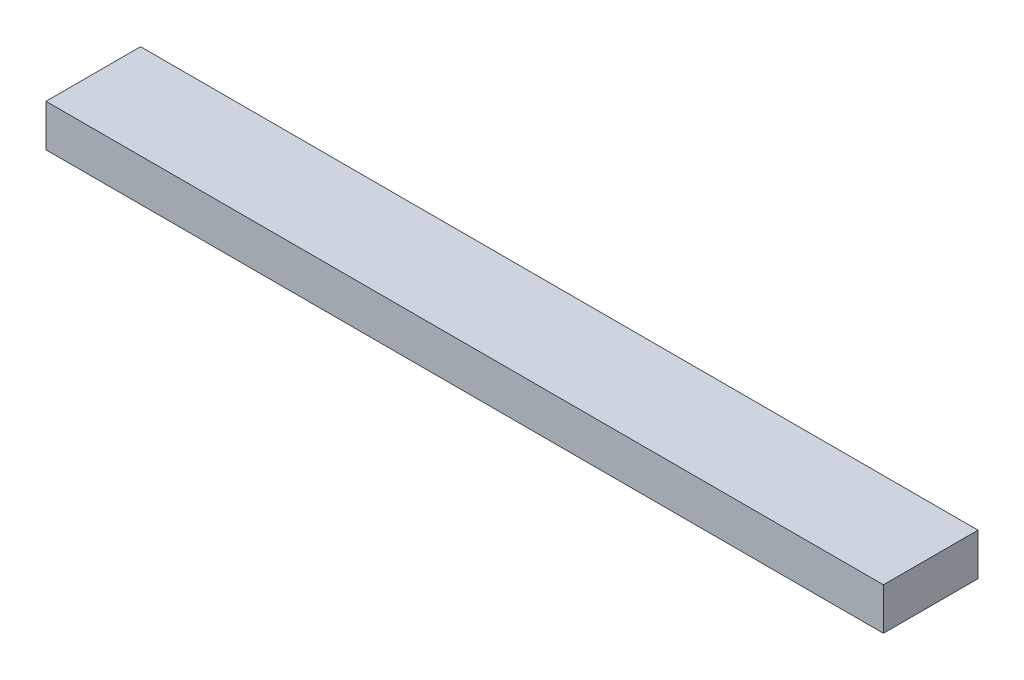
ISO-10303-21;
HEADER;
FILE_DESCRIPTION(('STEP AP214'),'2;1');
FILE_NAME('part.step','',(''),(''),'','','');
FILE_SCHEMA(('AUTOMOTIVE_DESIGN { 1 0 10303 214 1 1 1 1 }'));
ENDSEC;
DATA;
#1=APPLICATION_CONTEXT('core data for automotive mechanical design processes');
#2=APPLICATION_PROTOCOL_DEFINITION('international standard','automotive_design',2000,#1);
#3=PRODUCT_CONTEXT('',#1,'mechanical');
#4=PRODUCT('Part','Part','',(#3));
#5=PRODUCT_RELATED_PRODUCT_CATEGORY('part','',(#4));
#6=PRODUCT_DEFINITION_FORMATION('','',#4);
#7=PRODUCT_DEFINITION_CONTEXT('part definition',#1,'design');
#8=PRODUCT_DEFINITION('design','',#6,#7);
#9=PRODUCT_DEFINITION_SHAPE('','',#8);
#10=(LENGTH_UNIT() NAMED_UNIT(*) SI_UNIT(.MILLI.,.METRE.));
#11=(NAMED_UNIT(*) PLANE_ANGLE_UNIT() SI_UNIT($,.RADIAN.));
#12=(NAMED_UNIT(*) SI_UNIT($,.STERADIAN.) SOLID_ANGLE_UNIT());
#13=UNCERTAINTY_MEASURE_WITH_UNIT(LENGTH_MEASURE(1.E-05),#10,'distance_accuracy_value','');
#14=(GEOMETRIC_REPRESENTATION_CONTEXT(3) GLOBAL_UNCERTAINTY_ASSIGNED_CONTEXT((#13)) GLOBAL_UNIT_ASSIGNED_CONTEXT((#10,
#11,#12)) REPRESENTATION_CONTEXT('',''));
#15=CARTESIAN_POINT('',(0.,0.,0.));
#16=DIRECTION('',(0.,0.,1.));
#17=DIRECTION('',(1.,0.,0.));
#18=AXIS2_PLACEMENT_3D('',#15,#16,#17);
#19=CARTESIAN_POINT('',(0.,0.,0.));
#20=DIRECTION('',(0.,0.,-1.));
#21=DIRECTION('',(-1.,0.,0.));
#22=AXIS2_PLACEMENT_3D('',#19,#20,#21);
#23=PLANE('',#22);
#24=CARTESIAN_POINT('',(0.,-304.8,0.));
#25=DIRECTION('',(0.,0.,-1.));
#26=DIRECTION('',(-1.,0.,0.));
#27=AXIS2_PLACEMENT_3D('',#24,#25,#26);
#28=CIRCLE('',#27,1.5875);
#29=CARTESIAN_POINT('',(-1.5875,-304.8,0.));
#30=VERTEX_POINT('',#29);
#31=EDGE_CURVE('E39',#30,#30,#28,.T.);
#32=ORIENTED_EDGE('',*,*,#31,.F.);
#33=EDGE_LOOP('',(#32));
#34=FACE_BOUND('',#33,.T.);
#35=CARTESIAN_POINT('',(-107.438766336441,-304.8,0.));
#36=DIRECTION('',(0.,0.,-1.));
#37=DIRECTION('',(-1.,0.,0.));
#38=AXIS2_PLACEMENT_3D('',#35,#36,#37);
#39=CIRCLE('',#38,1.58750000000001);
#40=CARTESIAN_POINT('',(-109.026266336441,-304.8,0.));
#41=VERTEX_POINT('',#40);
#42=EDGE_CURVE('E98',#41,#41,#39,.T.);
#43=ORIENTED_EDGE('',*,*,#42,.F.);
#44=EDGE_LOOP('',(#43));
#45=FACE_BOUND('',#44,.T.);
#46=CARTESIAN_POINT('',(107.438766336441,-304.8,0.));
#47=DIRECTION('',(0.,0.,-1.));
#48=DIRECTION('',(-1.,0.,0.));
#49=AXIS2_PLACEMENT_3D('',#46,#47,#48);
#50=CIRCLE('',#49,1.58750000000001);
#51=CARTESIAN_POINT('',(105.851266336441,-304.8,0.));
#52=VERTEX_POINT('',#51);
#53=EDGE_CURVE('E102',#52,#52,#50,.T.);
#54=ORIENTED_EDGE('',*,*,#53,.F.);
#55=EDGE_LOOP('',(#54));
#56=FACE_BOUND('',#55,.T.);
#57=DIRECTION('',(0.,-1.,0.));
#58=VECTOR('',#57,1.);
#59=CARTESIAN_POINT('',(-126.488766336441,-311.15,0.));
#60=LINE('',#59,#58);
#61=CARTESIAN_POINT('',(-126.488766336441,-298.45,0.));
#62=VERTEX_POINT('',#61);
#63=CARTESIAN_POINT('',(-126.488766336441,-311.15,0.));
#64=VERTEX_POINT('',#63);
#65=EDGE_CURVE('E107',#62,#64,#60,.T.);
#66=ORIENTED_EDGE('',*,*,#65,.F.);
#67=DIRECTION('',(-1.,0.,0.));
#68=VECTOR('',#67,1.);
#69=CARTESIAN_POINT('',(-126.488766336441,-298.45,0.));
#70=LINE('',#69,#68);
#71=CARTESIAN_POINT('',(126.488766336441,-298.45,0.));
#72=VERTEX_POINT('',#71);
#73=EDGE_CURVE('E116',#72,#62,#70,.T.);
#74=ORIENTED_EDGE('',*,*,#73,.F.);
#75=DIRECTION('',(0.,1.,0.));
#76=VECTOR('',#75,1.);
#77=CARTESIAN_POINT('',(126.488766336441,-311.15,0.));
#78=LINE('',#77,#76);
#79=CARTESIAN_POINT('',(126.488766336441,-311.15,0.));
#80=VERTEX_POINT('',#79);
#81=EDGE_CURVE('E113',#80,#72,#78,.T.);
#82=ORIENTED_EDGE('',*,*,#81,.F.);
#83=DIRECTION('',(1.,0.,0.));
#84=VECTOR('',#83,1.);
#85=CARTESIAN_POINT('',(-126.488766336441,-311.15,0.));
#86=LINE('',#85,#84);
#87=EDGE_CURVE('E110',#64,#80,#86,.T.);
#88=ORIENTED_EDGE('',*,*,#87,.F.);
#89=EDGE_LOOP('',(#66,#74,#82,#88));
#90=FACE_BOUND('',#89,.T.);
#91=ADVANCED_FACE('F35',(#34,#45,#56,#90),#23,.T.);
#92=CARTESIAN_POINT('',(-126.488766336441,-298.45,281.871115322085));
#93=DIRECTION('',(0.,-1.,0.));
#94=DIRECTION('',(0.,0.,-1.));
#95=AXIS2_PLACEMENT_3D('',#92,#93,#94);
#96=PLANE('',#95);
#97=DIRECTION('',(0.,0.,-1.));
#98=VECTOR('',#97,1.);
#99=CARTESIAN_POINT('',(-126.488766336441,-298.45,281.871115322085));
#100=LINE('',#99,#98);
#101=CARTESIAN_POINT('',(-126.488766336441,-298.45,28.575));
#102=VERTEX_POINT('',#101);
#103=EDGE_CURVE('E119',#102,#62,#100,.T.);
#104=ORIENTED_EDGE('',*,*,#103,.F.);
#105=DIRECTION('',(1.,0.,0.));
#106=VECTOR('',#105,1.);
#107=CARTESIAN_POINT('',(-126.488766336441,-298.45,28.575));
#108=LINE('',#107,#106);
#109=CARTESIAN_POINT('',(126.488766336441,-298.45,28.575));
#110=VERTEX_POINT('',#109);
#111=EDGE_CURVE('E56',#102,#110,#108,.T.);
#112=ORIENTED_EDGE('',*,*,#111,.T.);
#113=DIRECTION('',(0.,0.,-1.));
#114=VECTOR('',#113,1.);
#115=CARTESIAN_POINT('',(126.488766336441,-298.45,281.871115322085));
#116=LINE('',#115,#114);
#117=EDGE_CURVE('E121',#110,#72,#116,.T.);
#118=ORIENTED_EDGE('',*,*,#117,.T.);
#119=ORIENTED_EDGE('',*,*,#73,.T.);
#120=EDGE_LOOP('',(#104,#112,#118,#119));
#121=FACE_BOUND('',#120,.T.);
#122=ADVANCED_FACE('F136',(#121),#96,.F.);
#123=CARTESIAN_POINT('',(126.488766336441,-311.15,281.871115322085));
#124=DIRECTION('',(-1.,0.,0.));
#125=DIRECTION('',(0.,0.,1.));
#126=AXIS2_PLACEMENT_3D('',#123,#124,#125);
#127=PLANE('',#126);
#128=ORIENTED_EDGE('',*,*,#117,.F.);
#129=DIRECTION('',(0.,-1.,0.));
#130=VECTOR('',#129,1.);
#131=CARTESIAN_POINT('',(126.488766336441,-311.15,28.575));
#132=LINE('',#131,#130);
#133=CARTESIAN_POINT('',(126.488766336441,-311.15,28.575));
#134=VERTEX_POINT('',#133);
#135=EDGE_CURVE('E103',#110,#134,#132,.T.);
#136=ORIENTED_EDGE('',*,*,#135,.T.);
#137=DIRECTION('',(0.,0.,-1.));
#138=VECTOR('',#137,1.);
#139=CARTESIAN_POINT('',(126.488766336441,-311.15,281.871115322085));
#140=LINE('',#139,#138);
#141=EDGE_CURVE('E123',#134,#80,#140,.T.);
#142=ORIENTED_EDGE('',*,*,#141,.T.);
#143=ORIENTED_EDGE('',*,*,#81,.T.);
#144=EDGE_LOOP('',(#128,#136,#142,#143));
#145=FACE_BOUND('',#144,.T.);
#146=ADVANCED_FACE('F151',(#145),#127,.F.);
#147=CARTESIAN_POINT('',(-126.488766336441,-311.15,281.871115322085));
#148=DIRECTION('',(0.,1.,0.));
#149=DIRECTION('',(0.,0.,1.));
#150=AXIS2_PLACEMENT_3D('',#147,#148,#149);
#151=PLANE('',#150);
#152=ORIENTED_EDGE('',*,*,#141,.F.);
#153=DIRECTION('',(-1.,0.,0.));
#154=VECTOR('',#153,1.);
#155=CARTESIAN_POINT('',(-126.488766336441,-311.15,28.575));
#156=LINE('',#155,#154);
#157=CARTESIAN_POINT('',(-126.488766336441,-311.15,28.575));
#158=VERTEX_POINT('',#157);
#159=EDGE_CURVE('E44',#134,#158,#156,.T.);
#160=ORIENTED_EDGE('',*,*,#159,.T.);
#161=DIRECTION('',(0.,0.,-1.));
#162=VECTOR('',#161,1.);
#163=CARTESIAN_POINT('',(-126.488766336441,-311.15,281.871115322085));
#164=LINE('',#163,#162);
#165=EDGE_CURVE('E125',#158,#64,#164,.T.);
#166=ORIENTED_EDGE('',*,*,#165,.T.);
#167=ORIENTED_EDGE('',*,*,#87,.T.);
#168=EDGE_LOOP('',(#152,#160,#166,#167));
#169=FACE_BOUND('',#168,.T.);
#170=ADVANCED_FACE('F153',(#169),#151,.F.);
#171=CARTESIAN_POINT('',(-126.488766336441,-311.15,281.871115322085));
#172=DIRECTION('',(1.,0.,0.));
#173=DIRECTION('',(0.,0.,-1.));
#174=AXIS2_PLACEMENT_3D('',#171,#172,#173);
#175=PLANE('',#174);
#176=ORIENTED_EDGE('',*,*,#165,.F.);
#177=DIRECTION('',(0.,1.,0.));
#178=VECTOR('',#177,1.);
#179=CARTESIAN_POINT('',(-126.488766336441,-311.15,28.575));
#180=LINE('',#179,#178);
#181=EDGE_CURVE('E11',#158,#102,#180,.T.);
#182=ORIENTED_EDGE('',*,*,#181,.T.);
#183=ORIENTED_EDGE('',*,*,#103,.T.);
#184=ORIENTED_EDGE('',*,*,#65,.T.);
#185=EDGE_LOOP('',(#176,#182,#183,#184));
#186=FACE_BOUND('',#185,.T.);
#187=ADVANCED_FACE('F37',(#186),#175,.F.);
#188=CARTESIAN_POINT('',(0.,0.,28.575));
#189=DIRECTION('',(0.,0.,-1.));
#190=DIRECTION('',(-1.,0.,0.));
#191=AXIS2_PLACEMENT_3D('',#188,#189,#190);
#192=PLANE('',#191);
#193=ORIENTED_EDGE('',*,*,#159,.F.);
#194=ORIENTED_EDGE('',*,*,#135,.F.);
#195=ORIENTED_EDGE('',*,*,#111,.F.);
#196=ORIENTED_EDGE('',*,*,#181,.F.);
#197=EDGE_LOOP('',(#193,#194,#195,#196));
#198=FACE_BOUND('',#197,.T.);
#199=ADVANCED_FACE('F159',(#198),#192,.F.);
#200=CARTESIAN_POINT('',(107.438766336441,-304.8,12.7));
#201=DIRECTION('',(0.,0.,-1.));
#202=DIRECTION('',(-1.,0.,0.));
#203=AXIS2_PLACEMENT_3D('',#200,#201,#202);
#204=CONICAL_SURFACE('',#203,1.58750000000001,1.02974425867666);
#205=CARTESIAN_POINT('',(107.438766336441,-304.8,13.6538662327062));
#206=VERTEX_POINT('',#205);
#207=VERTEX_LOOP('',#206);
#208=FACE_BOUND('',#207,.T.);
#209=CARTESIAN_POINT('',(107.438766336441,-304.8,12.7));
#210=DIRECTION('',(0.,0.,-1.));
#211=DIRECTION('',(-1.,0.,0.));
#212=AXIS2_PLACEMENT_3D('',#209,#210,#211);
#213=CIRCLE('',#212,1.58750000000001);
#214=CARTESIAN_POINT('',(105.851266336441,-304.8,12.7));
#215=VERTEX_POINT('',#214);
#216=EDGE_CURVE('E99',#215,#215,#213,.T.);
#217=ORIENTED_EDGE('',*,*,#216,.T.);
#218=EDGE_LOOP('',(#217));
#219=FACE_BOUND('',#218,.T.);
#220=ADVANCED_FACE('F166',(#208,#219),#204,.F.);
#221=CARTESIAN_POINT('',(107.438766336441,-304.8,-25.4));
#222=DIRECTION('',(0.,0.,-1.));
#223=DIRECTION('',(-1.,0.,0.));
#224=AXIS2_PLACEMENT_3D('',#221,#222,#223);
#225=CYLINDRICAL_SURFACE('',#224,1.58750000000001);
#226=ORIENTED_EDGE('',*,*,#53,.T.);
#227=EDGE_LOOP('',(#226));
#228=FACE_BOUND('',#227,.T.);
#229=ORIENTED_EDGE('',*,*,#216,.F.);
#230=EDGE_LOOP('',(#229));
#231=FACE_BOUND('',#230,.T.);
#232=ADVANCED_FACE('F169',(#228,#231),#225,.F.);
#233=CARTESIAN_POINT('',(-107.438766336441,-304.8,12.7));
#234=DIRECTION('',(0.,0.,-1.));
#235=DIRECTION('',(-1.,0.,0.));
#236=AXIS2_PLACEMENT_3D('',#233,#234,#235);
#237=CONICAL_SURFACE('',#236,1.58750000000001,1.02974425867666);
#238=CARTESIAN_POINT('',(-107.438766336441,-304.8,13.6538662327062));
#239=VERTEX_POINT('',#238);
#240=VERTEX_LOOP('',#239);
#241=FACE_BOUND('',#240,.T.);
#242=CARTESIAN_POINT('',(-107.438766336441,-304.8,12.7));
#243=DIRECTION('',(0.,0.,-1.));
#244=DIRECTION('',(-1.,0.,0.));
#245=AXIS2_PLACEMENT_3D('',#242,#243,#244);
#246=CIRCLE('',#245,1.58750000000001);
#247=CARTESIAN_POINT('',(-109.026266336441,-304.8,12.7));
#248=VERTEX_POINT('',#247);
#249=EDGE_CURVE('E94',#248,#248,#246,.T.);
#250=ORIENTED_EDGE('',*,*,#249,.T.);
#251=EDGE_LOOP('',(#250));
#252=FACE_BOUND('',#251,.T.);
#253=ADVANCED_FACE('F173',(#241,#252),#237,.F.);
#254=CARTESIAN_POINT('',(-107.438766336441,-304.8,-25.4));
#255=DIRECTION('',(0.,0.,-1.));
#256=DIRECTION('',(-1.,0.,0.));
#257=AXIS2_PLACEMENT_3D('',#254,#255,#256);
#258=CYLINDRICAL_SURFACE('',#257,1.58750000000001);
#259=ORIENTED_EDGE('',*,*,#42,.T.);
#260=EDGE_LOOP('',(#259));
#261=FACE_BOUND('',#260,.T.);
#262=ORIENTED_EDGE('',*,*,#249,.F.);
#263=EDGE_LOOP('',(#262));
#264=FACE_BOUND('',#263,.T.);
#265=ADVANCED_FACE('F86',(#261,#264),#258,.F.);
#266=CARTESIAN_POINT('',(0.,-304.8,12.7));
#267=DIRECTION('',(0.,0.,-1.));
#268=DIRECTION('',(-1.,0.,0.));
#269=AXIS2_PLACEMENT_3D('',#266,#267,#268);
#270=CONICAL_SURFACE('',#269,1.5875,1.02974425867666);
#271=CARTESIAN_POINT('',(0.,-304.8,13.6538662327062));
#272=VERTEX_POINT('',#271);
#273=VERTEX_LOOP('',#272);
#274=FACE_BOUND('',#273,.T.);
#275=CARTESIAN_POINT('',(0.,-304.8,12.7));
#276=DIRECTION('',(0.,0.,-1.));
#277=DIRECTION('',(-1.,0.,0.));
#278=AXIS2_PLACEMENT_3D('',#275,#276,#277);
#279=CIRCLE('',#278,1.5875);
#280=CARTESIAN_POINT('',(-1.5875,-304.8,12.7));
#281=VERTEX_POINT('',#280);
#282=EDGE_CURVE('E90',#281,#281,#279,.T.);
#283=ORIENTED_EDGE('',*,*,#282,.T.);
#284=EDGE_LOOP('',(#283));
#285=FACE_BOUND('',#284,.T.);
#286=ADVANCED_FACE('F82',(#274,#285),#270,.F.);
#287=CARTESIAN_POINT('',(0.,-304.8,-25.4));
#288=DIRECTION('',(0.,0.,-1.));
#289=DIRECTION('',(-1.,0.,0.));
#290=AXIS2_PLACEMENT_3D('',#287,#288,#289);
#291=CYLINDRICAL_SURFACE('',#290,1.5875);
#292=ORIENTED_EDGE('',*,*,#31,.T.);
#293=EDGE_LOOP('',(#292));
#294=FACE_BOUND('',#293,.T.);
#295=ORIENTED_EDGE('',*,*,#282,.F.);
#296=EDGE_LOOP('',(#295));
#297=FACE_BOUND('',#296,.T.);
#298=ADVANCED_FACE('F85',(#294,#297),#291,.F.);
#299=CLOSED_SHELL('',(#91,#122,#146,#170,#187,#199,#220,#232,#253,#265,#286,#298));
#300=MANIFOLD_SOLID_BREP('B2',#299);
#301=ADVANCED_BREP_SHAPE_REPRESENTATION('',(#18,#300),#14);
#302=SHAPE_DEFINITION_REPRESENTATION(#9,#301);
ENDSEC;
END-ISO-10303-21;
